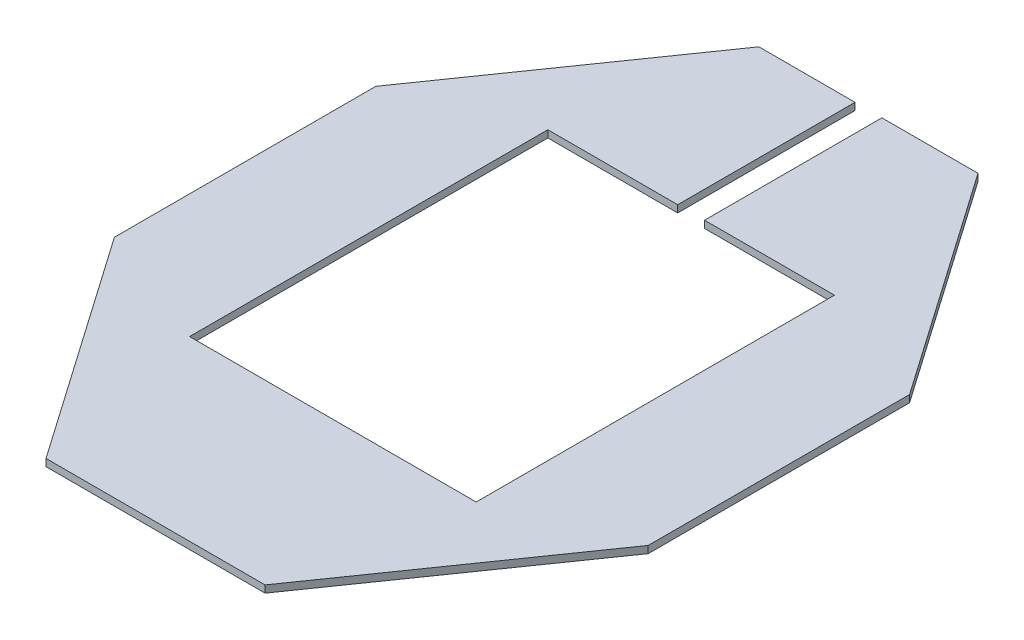
ISO-10303-21;
HEADER;
FILE_DESCRIPTION(('STEP AP214'),'2;1');
FILE_NAME('part.step','',(''),(''),'','','');
FILE_SCHEMA(('AUTOMOTIVE_DESIGN { 1 0 10303 214 1 1 1 1 }'));
ENDSEC;
DATA;
#1=APPLICATION_CONTEXT('core data for automotive mechanical design processes');
#2=APPLICATION_PROTOCOL_DEFINITION('international standard','automotive_design',2000,#1);
#3=PRODUCT_CONTEXT('',#1,'mechanical');
#4=PRODUCT('Part','Part','',(#3));
#5=PRODUCT_RELATED_PRODUCT_CATEGORY('part','',(#4));
#6=PRODUCT_DEFINITION_FORMATION('','',#4);
#7=PRODUCT_DEFINITION_CONTEXT('part definition',#1,'design');
#8=PRODUCT_DEFINITION('design','',#6,#7);
#9=PRODUCT_DEFINITION_SHAPE('','',#8);
#10=(LENGTH_UNIT() NAMED_UNIT(*) SI_UNIT(.MILLI.,.METRE.));
#11=(NAMED_UNIT(*) PLANE_ANGLE_UNIT() SI_UNIT($,.RADIAN.));
#12=(NAMED_UNIT(*) SI_UNIT($,.STERADIAN.) SOLID_ANGLE_UNIT());
#13=UNCERTAINTY_MEASURE_WITH_UNIT(LENGTH_MEASURE(1.E-05),#10,'distance_accuracy_value','');
#14=(GEOMETRIC_REPRESENTATION_CONTEXT(3) GLOBAL_UNCERTAINTY_ASSIGNED_CONTEXT((#13)) GLOBAL_UNIT_ASSIGNED_CONTEXT((#10,
#11,#12)) REPRESENTATION_CONTEXT('',''));
#15=CARTESIAN_POINT('',(0.,0.,0.));
#16=DIRECTION('',(0.,0.,1.));
#17=DIRECTION('',(1.,0.,0.));
#18=AXIS2_PLACEMENT_3D('',#15,#16,#17);
#19=CARTESIAN_POINT('',(-8.,4.375,-10.));
#20=DIRECTION('',(0.,0.,-1.));
#21=DIRECTION('',(-1.,0.,0.));
#22=AXIS2_PLACEMENT_3D('',#19,#20,#21);
#23=PLANE('',#22);
#24=DIRECTION('',(1.,0.,0.));
#25=VECTOR('',#24,1.);
#26=CARTESIAN_POINT('',(-8.,0.25,-10.));
#27=LINE('',#26,#25);
#28=CARTESIAN_POINT('',(-8.,0.25,-10.));
#29=VERTEX_POINT('',#28);
#30=CARTESIAN_POINT('',(-0.749999999999999,0.25,-10.));
#31=VERTEX_POINT('',#30);
#32=EDGE_CURVE('E184',#29,#31,#27,.T.);
#33=ORIENTED_EDGE('',*,*,#32,.T.);
#34=DIRECTION('',(0.,1.,0.));
#35=VECTOR('',#34,1.);
#36=CARTESIAN_POINT('',(-0.749999999999999,4.375,-10.));
#37=LINE('',#36,#35);
#38=CARTESIAN_POINT('',(-0.749999999999999,0.65,-10.));
#39=VERTEX_POINT('',#38);
#40=EDGE_CURVE('E217',#31,#39,#37,.T.);
#41=ORIENTED_EDGE('',*,*,#40,.T.);
#42=DIRECTION('',(-1.,0.,0.));
#43=VECTOR('',#42,1.);
#44=CARTESIAN_POINT('',(0.,0.65,-10.));
#45=LINE('',#44,#43);
#46=CARTESIAN_POINT('',(-8.,0.65,-10.));
#47=VERTEX_POINT('',#46);
#48=EDGE_CURVE('E196',#39,#47,#45,.T.);
#49=ORIENTED_EDGE('',*,*,#48,.T.);
#50=DIRECTION('',(0.,-1.,0.));
#51=VECTOR('',#50,1.);
#52=CARTESIAN_POINT('',(-8.,4.375,-10.));
#53=LINE('',#52,#51);
#54=EDGE_CURVE('E193',#47,#29,#53,.T.);
#55=ORIENTED_EDGE('',*,*,#54,.T.);
#56=EDGE_LOOP('',(#33,#41,#49,#55));
#57=FACE_BOUND('',#56,.T.);
#58=ADVANCED_FACE('F35',(#57),#23,.F.);
#59=CARTESIAN_POINT('',(0.,0.65,0.));
#60=DIRECTION('',(0.,1.,0.));
#61=DIRECTION('',(0.,0.,1.));
#62=AXIS2_PLACEMENT_3D('',#59,#60,#61);
#63=PLANE('',#62);
#64=DIRECTION('',(0.,0.,-1.));
#65=VECTOR('',#64,1.);
#66=CARTESIAN_POINT('',(-14.9,0.65,0.));
#67=LINE('',#66,#65);
#68=CARTESIAN_POINT('',(-14.9,0.65,7.29565217391304));
#69=VERTEX_POINT('',#68);
#70=CARTESIAN_POINT('',(-14.9,0.65,-7.29565217391304));
#71=VERTEX_POINT('',#70);
#72=EDGE_CURVE('E50',#69,#71,#67,.T.);
#73=ORIENTED_EDGE('',*,*,#72,.F.);
#74=DIRECTION('',(-0.571792661688173,0.,-0.820398166769987));
#75=VECTOR('',#74,1.);
#76=CARTESIAN_POINT('',(-13.4508652657602,0.65,9.37484548825711));
#77=LINE('',#76,#75);
#78=CARTESIAN_POINT('',(-6.11515151515152,0.65,19.9));
#79=VERTEX_POINT('',#78);
#80=EDGE_CURVE('E178',#79,#69,#77,.T.);
#81=ORIENTED_EDGE('',*,*,#80,.F.);
#82=DIRECTION('',(-1.,0.,0.));
#83=VECTOR('',#82,1.);
#84=CARTESIAN_POINT('',(0.,0.65,19.9));
#85=LINE('',#84,#83);
#86=CARTESIAN_POINT('',(6.11515151515152,0.65,19.9));
#87=VERTEX_POINT('',#86);
#88=EDGE_CURVE('E266',#87,#79,#85,.T.);
#89=ORIENTED_EDGE('',*,*,#88,.F.);
#90=DIRECTION('',(-0.571792661688173,0.,0.820398166769987));
#91=VECTOR('',#90,1.);
#92=CARTESIAN_POINT('',(13.4508652657602,0.65,9.37484548825711));
#93=LINE('',#92,#91);
#94=CARTESIAN_POINT('',(14.9,0.65,7.29565217391304));
#95=VERTEX_POINT('',#94);
#96=EDGE_CURVE('E174',#95,#87,#93,.T.);
#97=ORIENTED_EDGE('',*,*,#96,.F.);
#98=DIRECTION('',(0.,0.,1.));
#99=VECTOR('',#98,1.);
#100=CARTESIAN_POINT('',(14.9,0.65,0.));
#101=LINE('',#100,#99);
#102=CARTESIAN_POINT('',(14.9,0.65,-7.29565217391304));
#103=VERTEX_POINT('',#102);
#104=EDGE_CURVE('E261',#103,#95,#101,.T.);
#105=ORIENTED_EDGE('',*,*,#104,.F.);
#106=DIRECTION('',(0.571792661688173,0.,0.820398166769987));
#107=VECTOR('',#106,1.);
#108=CARTESIAN_POINT('',(13.4508652657602,0.65,-9.37484548825711));
#109=LINE('',#108,#107);
#110=CARTESIAN_POINT('',(6.11515151515152,0.65,-19.9));
#111=VERTEX_POINT('',#110);
#112=EDGE_CURVE('E165',#111,#103,#109,.T.);
#113=ORIENTED_EDGE('',*,*,#112,.F.);
#114=DIRECTION('',(1.,0.,0.));
#115=VECTOR('',#114,1.);
#116=CARTESIAN_POINT('',(0.,0.65,-19.9));
#117=LINE('',#116,#115);
#118=CARTESIAN_POINT('',(0.750000000000002,0.65,-19.9));
#119=VERTEX_POINT('',#118);
#120=EDGE_CURVE('E287',#119,#111,#117,.T.);
#121=ORIENTED_EDGE('',*,*,#120,.F.);
#122=DIRECTION('',(0.,0.,-1.));
#123=VECTOR('',#122,1.);
#124=CARTESIAN_POINT('',(0.75,0.65,0.));
#125=LINE('',#124,#123);
#126=CARTESIAN_POINT('',(0.750000000000001,0.65,-10.));
#127=VERTEX_POINT('',#126);
#128=EDGE_CURVE('E232',#127,#119,#125,.T.);
#129=ORIENTED_EDGE('',*,*,#128,.F.);
#130=CARTESIAN_POINT('',(8.,0.65,-10.));
#131=VERTEX_POINT('',#130);
#132=EDGE_CURVE('E204',#131,#127,#45,.T.);
#133=ORIENTED_EDGE('',*,*,#132,.F.);
#134=DIRECTION('',(0.,0.,-1.));
#135=VECTOR('',#134,1.);
#136=CARTESIAN_POINT('',(8.,0.65,0.));
#137=LINE('',#136,#135);
#138=CARTESIAN_POINT('',(8.,0.65,10.));
#139=VERTEX_POINT('',#138);
#140=EDGE_CURVE('E207',#139,#131,#137,.T.);
#141=ORIENTED_EDGE('',*,*,#140,.F.);
#142=DIRECTION('',(1.,0.,0.));
#143=VECTOR('',#142,1.);
#144=CARTESIAN_POINT('',(0.,0.65,10.));
#145=LINE('',#144,#143);
#146=CARTESIAN_POINT('',(-8.,0.65,10.));
#147=VERTEX_POINT('',#146);
#148=EDGE_CURVE('E210',#147,#139,#145,.T.);
#149=ORIENTED_EDGE('',*,*,#148,.F.);
#150=DIRECTION('',(0.,0.,1.));
#151=VECTOR('',#150,1.);
#152=CARTESIAN_POINT('',(-8.,0.65,0.));
#153=LINE('',#152,#151);
#154=EDGE_CURVE('E212',#47,#147,#153,.T.);
#155=ORIENTED_EDGE('',*,*,#154,.F.);
#156=ORIENTED_EDGE('',*,*,#48,.F.);
#157=DIRECTION('',(0.,0.,1.));
#158=VECTOR('',#157,1.);
#159=CARTESIAN_POINT('',(-0.75,0.65,0.));
#160=LINE('',#159,#158);
#161=CARTESIAN_POINT('',(-0.749999999999998,0.65,-19.9));
#162=VERTEX_POINT('',#161);
#163=EDGE_CURVE('E243',#162,#39,#160,.T.);
#164=ORIENTED_EDGE('',*,*,#163,.F.);
#165=CARTESIAN_POINT('',(-6.11515151515151,0.65,-19.9));
#166=VERTEX_POINT('',#165);
#167=EDGE_CURVE('E57',#166,#162,#117,.T.);
#168=ORIENTED_EDGE('',*,*,#167,.F.);
#169=DIRECTION('',(0.571792661688173,0.,-0.820398166769987));
#170=VECTOR('',#169,1.);
#171=CARTESIAN_POINT('',(-13.4508652657602,0.65,-9.37484548825711));
#172=LINE('',#171,#170);
#173=EDGE_CURVE('E164',#71,#166,#172,.T.);
#174=ORIENTED_EDGE('',*,*,#173,.F.);
#175=EDGE_LOOP('',(#73,#81,#89,#97,#105,#113,#121,#129,#133,#141,#149,#155,#156,#164,#168,#174));
#176=FACE_BOUND('',#175,.T.);
#177=ADVANCED_FACE('F37',(#176),#63,.T.);
#178=CARTESIAN_POINT('',(0.,0.25,0.));
#179=DIRECTION('',(0.,1.,0.));
#180=DIRECTION('',(0.,0.,1.));
#181=AXIS2_PLACEMENT_3D('',#178,#179,#180);
#182=PLANE('',#181);
#183=DIRECTION('',(0.571792661688173,0.,0.820398166769987));
#184=VECTOR('',#183,1.);
#185=CARTESIAN_POINT('',(-5.,0.25,21.5));
#186=LINE('',#185,#184);
#187=CARTESIAN_POINT('',(-14.9,0.25,7.29565217391305));
#188=VERTEX_POINT('',#187);
#189=CARTESIAN_POINT('',(-6.11515151515152,0.25,19.9));
#190=VERTEX_POINT('',#189);
#191=EDGE_CURVE('E159',#188,#190,#186,.T.);
#192=ORIENTED_EDGE('',*,*,#191,.F.);
#193=DIRECTION('',(0.,0.,-1.));
#194=VECTOR('',#193,1.);
#195=CARTESIAN_POINT('',(-14.9,0.25,0.));
#196=LINE('',#195,#194);
#197=CARTESIAN_POINT('',(-14.9,0.249999999999999,-7.29565217391304));
#198=VERTEX_POINT('',#197);
#199=EDGE_CURVE('E147',#188,#198,#196,.T.);
#200=ORIENTED_EDGE('',*,*,#199,.T.);
#201=DIRECTION('',(-0.571792661688173,0.,0.820398166769987));
#202=VECTOR('',#201,1.);
#203=CARTESIAN_POINT('',(-16.5,0.25,-5.));
#204=LINE('',#203,#202);
#205=CARTESIAN_POINT('',(-6.11515151515152,0.25,-19.9));
#206=VERTEX_POINT('',#205);
#207=EDGE_CURVE('E157',#206,#198,#204,.T.);
#208=ORIENTED_EDGE('',*,*,#207,.F.);
#209=DIRECTION('',(1.,0.,0.));
#210=VECTOR('',#209,1.);
#211=CARTESIAN_POINT('',(0.,0.25,-19.9));
#212=LINE('',#211,#210);
#213=CARTESIAN_POINT('',(-0.749999999999998,0.25,-19.9));
#214=VERTEX_POINT('',#213);
#215=EDGE_CURVE('E285',#206,#214,#212,.T.);
#216=ORIENTED_EDGE('',*,*,#215,.T.);
#217=DIRECTION('',(0.,0.,-1.));
#218=VECTOR('',#217,1.);
#219=CARTESIAN_POINT('',(-0.749999999999999,0.25,-10.));
#220=LINE('',#219,#218);
#221=EDGE_CURVE('E241',#31,#214,#220,.T.);
#222=ORIENTED_EDGE('',*,*,#221,.F.);
#223=ORIENTED_EDGE('',*,*,#32,.F.);
#224=DIRECTION('',(0.,0.,-1.));
#225=VECTOR('',#224,1.);
#226=CARTESIAN_POINT('',(-8.,0.25,-10.));
#227=LINE('',#226,#225);
#228=CARTESIAN_POINT('',(-8.,0.25,10.));
#229=VERTEX_POINT('',#228);
#230=EDGE_CURVE('E181',#229,#29,#227,.T.);
#231=ORIENTED_EDGE('',*,*,#230,.F.);
#232=DIRECTION('',(-1.,0.,0.));
#233=VECTOR('',#232,1.);
#234=CARTESIAN_POINT('',(-8.,0.25,10.));
#235=LINE('',#234,#233);
#236=CARTESIAN_POINT('',(8.,0.25,10.));
#237=VERTEX_POINT('',#236);
#238=EDGE_CURVE('E190',#237,#229,#235,.T.);
#239=ORIENTED_EDGE('',*,*,#238,.F.);
#240=DIRECTION('',(0.,0.,1.));
#241=VECTOR('',#240,1.);
#242=CARTESIAN_POINT('',(8.,0.25,-10.));
#243=LINE('',#242,#241);
#244=CARTESIAN_POINT('',(8.,0.25,-10.));
#245=VERTEX_POINT('',#244);
#246=EDGE_CURVE('E187',#245,#237,#243,.T.);
#247=ORIENTED_EDGE('',*,*,#246,.F.);
#248=CARTESIAN_POINT('',(0.750000000000002,0.25,-10.));
#249=VERTEX_POINT('',#248);
#250=EDGE_CURVE('E183',#249,#245,#27,.T.);
#251=ORIENTED_EDGE('',*,*,#250,.F.);
#252=DIRECTION('',(0.,0.,1.));
#253=VECTOR('',#252,1.);
#254=CARTESIAN_POINT('',(0.750000000000001,0.25,-10.));
#255=LINE('',#254,#253);
#256=CARTESIAN_POINT('',(0.750000000000002,0.25,-19.9));
#257=VERTEX_POINT('',#256);
#258=EDGE_CURVE('E230',#257,#249,#255,.T.);
#259=ORIENTED_EDGE('',*,*,#258,.F.);
#260=CARTESIAN_POINT('',(6.11515151515151,0.25,-19.9));
#261=VERTEX_POINT('',#260);
#262=EDGE_CURVE('E238',#257,#261,#212,.T.);
#263=ORIENTED_EDGE('',*,*,#262,.T.);
#264=DIRECTION('',(-0.571792661688173,0.,-0.820398166769987));
#265=VECTOR('',#264,1.);
#266=CARTESIAN_POINT('',(16.5,0.25,-5.));
#267=LINE('',#266,#265);
#268=CARTESIAN_POINT('',(14.9,0.25,-7.29565217391304));
#269=VERTEX_POINT('',#268);
#270=EDGE_CURVE('E169',#269,#261,#267,.T.);
#271=ORIENTED_EDGE('',*,*,#270,.F.);
#272=DIRECTION('',(0.,0.,1.));
#273=VECTOR('',#272,1.);
#274=CARTESIAN_POINT('',(14.9,0.25,0.));
#275=LINE('',#274,#273);
#276=CARTESIAN_POINT('',(14.9,0.25,7.29565217391303));
#277=VERTEX_POINT('',#276);
#278=EDGE_CURVE('E258',#269,#277,#275,.T.);
#279=ORIENTED_EDGE('',*,*,#278,.T.);
#280=DIRECTION('',(0.571792661688173,0.,-0.820398166769987));
#281=VECTOR('',#280,1.);
#282=CARTESIAN_POINT('',(5.,0.25,21.5));
#283=LINE('',#282,#281);
#284=CARTESIAN_POINT('',(6.11515151515152,0.25,19.9));
#285=VERTEX_POINT('',#284);
#286=EDGE_CURVE('E167',#285,#277,#283,.T.);
#287=ORIENTED_EDGE('',*,*,#286,.F.);
#288=DIRECTION('',(-1.,0.,0.));
#289=VECTOR('',#288,1.);
#290=CARTESIAN_POINT('',(0.,0.25,19.9));
#291=LINE('',#290,#289);
#292=EDGE_CURVE('E279',#285,#190,#291,.T.);
#293=ORIENTED_EDGE('',*,*,#292,.T.);
#294=EDGE_LOOP('',(#192,#200,#208,#216,#222,#223,#231,#239,#247,#251,#259,#263,#271,#279,#287,#293));
#295=FACE_BOUND('',#294,.T.);
#296=ADVANCED_FACE('F155',(#295),#182,.F.);
#297=CARTESIAN_POINT('',(-8.,4.375,-10.));
#298=DIRECTION('',(-1.,0.,0.));
#299=DIRECTION('',(0.,0.,1.));
#300=AXIS2_PLACEMENT_3D('',#297,#298,#299);
#301=PLANE('',#300);
#302=ORIENTED_EDGE('',*,*,#154,.T.);
#303=DIRECTION('',(0.,-1.,0.));
#304=VECTOR('',#303,1.);
#305=CARTESIAN_POINT('',(-8.,4.375,10.));
#306=LINE('',#305,#304);
#307=EDGE_CURVE('E194',#147,#229,#306,.T.);
#308=ORIENTED_EDGE('',*,*,#307,.T.);
#309=ORIENTED_EDGE('',*,*,#230,.T.);
#310=ORIENTED_EDGE('',*,*,#54,.F.);
#311=EDGE_LOOP('',(#302,#308,#309,#310));
#312=FACE_BOUND('',#311,.T.);
#313=ADVANCED_FACE('F308',(#312),#301,.F.);
#314=CARTESIAN_POINT('',(-8.,4.375,10.));
#315=DIRECTION('',(0.,0.,1.));
#316=DIRECTION('',(1.,0.,0.));
#317=AXIS2_PLACEMENT_3D('',#314,#315,#316);
#318=PLANE('',#317);
#319=ORIENTED_EDGE('',*,*,#148,.T.);
#320=DIRECTION('',(0.,-1.,0.));
#321=VECTOR('',#320,1.);
#322=CARTESIAN_POINT('',(8.,4.375,10.));
#323=LINE('',#322,#321);
#324=EDGE_CURVE('E197',#139,#237,#323,.T.);
#325=ORIENTED_EDGE('',*,*,#324,.T.);
#326=ORIENTED_EDGE('',*,*,#238,.T.);
#327=ORIENTED_EDGE('',*,*,#307,.F.);
#328=EDGE_LOOP('',(#319,#325,#326,#327));
#329=FACE_BOUND('',#328,.T.);
#330=ADVANCED_FACE('F310',(#329),#318,.F.);
#331=CARTESIAN_POINT('',(8.,4.375,-10.));
#332=DIRECTION('',(1.,0.,0.));
#333=DIRECTION('',(0.,0.,-1.));
#334=AXIS2_PLACEMENT_3D('',#331,#332,#333);
#335=PLANE('',#334);
#336=ORIENTED_EDGE('',*,*,#140,.T.);
#337=DIRECTION('',(0.,-1.,0.));
#338=VECTOR('',#337,1.);
#339=CARTESIAN_POINT('',(8.,4.375,-10.));
#340=LINE('',#339,#338);
#341=EDGE_CURVE('E199',#131,#245,#340,.T.);
#342=ORIENTED_EDGE('',*,*,#341,.T.);
#343=ORIENTED_EDGE('',*,*,#246,.T.);
#344=ORIENTED_EDGE('',*,*,#324,.F.);
#345=EDGE_LOOP('',(#336,#342,#343,#344));
#346=FACE_BOUND('',#345,.T.);
#347=ADVANCED_FACE('F315',(#346),#335,.F.);
#348=ORIENTED_EDGE('',*,*,#132,.T.);
#349=DIRECTION('',(0.,-1.,0.));
#350=VECTOR('',#349,1.);
#351=CARTESIAN_POINT('',(0.750000000000001,4.375,-10.));
#352=LINE('',#351,#350);
#353=EDGE_CURVE('E214',#127,#249,#352,.T.);
#354=ORIENTED_EDGE('',*,*,#353,.T.);
#355=ORIENTED_EDGE('',*,*,#250,.T.);
#356=ORIENTED_EDGE('',*,*,#341,.F.);
#357=EDGE_LOOP('',(#348,#354,#355,#356));
#358=FACE_BOUND('',#357,.T.);
#359=ADVANCED_FACE('F318',(#358),#23,.F.);
#360=CARTESIAN_POINT('',(-5.,4.375,21.5));
#361=DIRECTION('',(0.820398166769987,0.,-0.571792661688173));
#362=DIRECTION('',(-0.571792661688173,0.,-0.820398166769987));
#363=AXIS2_PLACEMENT_3D('',#360,#361,#362);
#364=PLANE('',#363);
#365=ORIENTED_EDGE('',*,*,#80,.T.);
#366=DIRECTION('',(0.,-1.,0.));
#367=VECTOR('',#366,1.);
#368=CARTESIAN_POINT('',(-14.9,4.375,7.29565217391304));
#369=LINE('',#368,#367);
#370=EDGE_CURVE('E290',#69,#188,#369,.T.);
#371=ORIENTED_EDGE('',*,*,#370,.T.);
#372=ORIENTED_EDGE('',*,*,#191,.T.);
#373=DIRECTION('',(0.,1.,0.));
#374=VECTOR('',#373,1.);
#375=CARTESIAN_POINT('',(-6.11515151515152,4.375,19.9));
#376=LINE('',#375,#374);
#377=EDGE_CURVE('E262',#190,#79,#376,.T.);
#378=ORIENTED_EDGE('',*,*,#377,.T.);
#379=EDGE_LOOP('',(#365,#371,#372,#378));
#380=FACE_BOUND('',#379,.T.);
#381=ADVANCED_FACE('F293',(#380),#364,.F.);
#382=CARTESIAN_POINT('',(5.,4.375,21.5));
#383=DIRECTION('',(-0.820398166769987,0.,-0.571792661688173));
#384=DIRECTION('',(-0.571792661688173,0.,0.820398166769987));
#385=AXIS2_PLACEMENT_3D('',#382,#383,#384);
#386=PLANE('',#385);
#387=ORIENTED_EDGE('',*,*,#96,.T.);
#388=DIRECTION('',(0.,-1.,0.));
#389=VECTOR('',#388,1.);
#390=CARTESIAN_POINT('',(6.11515151515152,4.375,19.9));
#391=LINE('',#390,#389);
#392=EDGE_CURVE('E223',#87,#285,#391,.T.);
#393=ORIENTED_EDGE('',*,*,#392,.T.);
#394=ORIENTED_EDGE('',*,*,#286,.T.);
#395=DIRECTION('',(0.,1.,0.));
#396=VECTOR('',#395,1.);
#397=CARTESIAN_POINT('',(14.9,4.375,7.29565217391304));
#398=LINE('',#397,#396);
#399=EDGE_CURVE('E246',#277,#95,#398,.T.);
#400=ORIENTED_EDGE('',*,*,#399,.T.);
#401=EDGE_LOOP('',(#387,#393,#394,#400));
#402=FACE_BOUND('',#401,.T.);
#403=ADVANCED_FACE('F272',(#402),#386,.F.);
#404=CARTESIAN_POINT('',(-16.5,4.375,-5.));
#405=DIRECTION('',(0.820398166769987,0.,0.571792661688173));
#406=DIRECTION('',(0.571792661688173,0.,-0.820398166769987));
#407=AXIS2_PLACEMENT_3D('',#404,#405,#406);
#408=PLANE('',#407);
#409=ORIENTED_EDGE('',*,*,#207,.T.);
#410=DIRECTION('',(0.,1.,0.));
#411=VECTOR('',#410,1.);
#412=CARTESIAN_POINT('',(-14.9,4.375,-7.29565217391304));
#413=LINE('',#412,#411);
#414=EDGE_CURVE('E11',#198,#71,#413,.T.);
#415=ORIENTED_EDGE('',*,*,#414,.T.);
#416=ORIENTED_EDGE('',*,*,#173,.T.);
#417=DIRECTION('',(0.,-1.,0.));
#418=VECTOR('',#417,1.);
#419=CARTESIAN_POINT('',(-6.11515151515152,4.375,-19.9));
#420=LINE('',#419,#418);
#421=EDGE_CURVE('E163',#166,#206,#420,.T.);
#422=ORIENTED_EDGE('',*,*,#421,.T.);
#423=EDGE_LOOP('',(#409,#415,#416,#422));
#424=FACE_BOUND('',#423,.T.);
#425=ADVANCED_FACE('F162',(#424),#408,.F.);
#426=CARTESIAN_POINT('',(16.5,4.375,-5.));
#427=DIRECTION('',(-0.820398166769987,0.,0.571792661688173));
#428=DIRECTION('',(0.571792661688173,0.,0.820398166769987));
#429=AXIS2_PLACEMENT_3D('',#426,#427,#428);
#430=PLANE('',#429);
#431=ORIENTED_EDGE('',*,*,#270,.T.);
#432=DIRECTION('',(0.,1.,0.));
#433=VECTOR('',#432,1.);
#434=CARTESIAN_POINT('',(6.11515151515152,4.375,-19.9));
#435=LINE('',#434,#433);
#436=EDGE_CURVE('E253',#261,#111,#435,.T.);
#437=ORIENTED_EDGE('',*,*,#436,.T.);
#438=ORIENTED_EDGE('',*,*,#112,.T.);
#439=DIRECTION('',(0.,-1.,0.));
#440=VECTOR('',#439,1.);
#441=CARTESIAN_POINT('',(14.9,4.375,-7.29565217391304));
#442=LINE('',#441,#440);
#443=EDGE_CURVE('E220',#103,#269,#442,.T.);
#444=ORIENTED_EDGE('',*,*,#443,.T.);
#445=EDGE_LOOP('',(#431,#437,#438,#444));
#446=FACE_BOUND('',#445,.T.);
#447=ADVANCED_FACE('F252',(#446),#430,.F.);
#448=CARTESIAN_POINT('',(-0.749999999999999,10.25,-10.));
#449=DIRECTION('',(-1.,0.,0.));
#450=DIRECTION('',(0.,0.,1.));
#451=AXIS2_PLACEMENT_3D('',#448,#449,#450);
#452=PLANE('',#451);
#453=ORIENTED_EDGE('',*,*,#221,.T.);
#454=DIRECTION('',(0.,1.,0.));
#455=VECTOR('',#454,1.);
#456=CARTESIAN_POINT('',(-0.749999999999998,10.25,-19.9));
#457=LINE('',#456,#455);
#458=EDGE_CURVE('E283',#214,#162,#457,.T.);
#459=ORIENTED_EDGE('',*,*,#458,.T.);
#460=ORIENTED_EDGE('',*,*,#163,.T.);
#461=ORIENTED_EDGE('',*,*,#40,.F.);
#462=EDGE_LOOP('',(#453,#459,#460,#461));
#463=FACE_BOUND('',#462,.T.);
#464=ADVANCED_FACE('F299',(#463),#452,.F.);
#465=CARTESIAN_POINT('',(0.750000000000001,10.25,-10.));
#466=DIRECTION('',(1.,0.,0.));
#467=DIRECTION('',(0.,0.,-1.));
#468=AXIS2_PLACEMENT_3D('',#465,#466,#467);
#469=PLANE('',#468);
#470=ORIENTED_EDGE('',*,*,#128,.T.);
#471=DIRECTION('',(0.,-1.,0.));
#472=VECTOR('',#471,1.);
#473=CARTESIAN_POINT('',(0.750000000000002,10.25,-19.9));
#474=LINE('',#473,#472);
#475=EDGE_CURVE('E43',#119,#257,#474,.T.);
#476=ORIENTED_EDGE('',*,*,#475,.T.);
#477=ORIENTED_EDGE('',*,*,#258,.T.);
#478=ORIENTED_EDGE('',*,*,#353,.F.);
#479=EDGE_LOOP('',(#470,#476,#477,#478));
#480=FACE_BOUND('',#479,.T.);
#481=ADVANCED_FACE('F229',(#480),#469,.F.);
#482=CARTESIAN_POINT('',(14.9,5.25,11.7880750810146));
#483=DIRECTION('',(-1.,0.,0.));
#484=DIRECTION('',(0.,0.,1.));
#485=AXIS2_PLACEMENT_3D('',#482,#483,#484);
#486=PLANE('',#485);
#487=ORIENTED_EDGE('',*,*,#278,.F.);
#488=ORIENTED_EDGE('',*,*,#443,.F.);
#489=ORIENTED_EDGE('',*,*,#104,.T.);
#490=ORIENTED_EDGE('',*,*,#399,.F.);
#491=EDGE_LOOP('',(#487,#488,#489,#490));
#492=FACE_BOUND('',#491,.T.);
#493=ADVANCED_FACE('F327',(#492),#486,.F.);
#494=CARTESIAN_POINT('',(10.5231406774872,5.25,19.9));
#495=DIRECTION('',(0.,0.,-1.));
#496=DIRECTION('',(-1.,0.,0.));
#497=AXIS2_PLACEMENT_3D('',#494,#495,#496);
#498=PLANE('',#497);
#499=ORIENTED_EDGE('',*,*,#292,.F.);
#500=ORIENTED_EDGE('',*,*,#392,.F.);
#501=ORIENTED_EDGE('',*,*,#88,.T.);
#502=ORIENTED_EDGE('',*,*,#377,.F.);
#503=EDGE_LOOP('',(#499,#500,#501,#502));
#504=FACE_BOUND('',#503,.T.);
#505=ADVANCED_FACE('F321',(#504),#498,.F.);
#506=CARTESIAN_POINT('',(-10.2725897089756,5.25,-19.9));
#507=DIRECTION('',(0.,0.,1.));
#508=DIRECTION('',(1.,0.,0.));
#509=AXIS2_PLACEMENT_3D('',#506,#507,#508);
#510=PLANE('',#509);
#511=ORIENTED_EDGE('',*,*,#262,.F.);
#512=ORIENTED_EDGE('',*,*,#475,.F.);
#513=ORIENTED_EDGE('',*,*,#120,.T.);
#514=ORIENTED_EDGE('',*,*,#436,.F.);
#515=EDGE_LOOP('',(#511,#512,#513,#514));
#516=FACE_BOUND('',#515,.T.);
#517=ADVANCED_FACE('F319',(#516),#510,.F.);
#518=ORIENTED_EDGE('',*,*,#167,.T.);
#519=ORIENTED_EDGE('',*,*,#458,.F.);
#520=ORIENTED_EDGE('',*,*,#215,.F.);
#521=ORIENTED_EDGE('',*,*,#421,.F.);
#522=EDGE_LOOP('',(#518,#519,#520,#521));
#523=FACE_BOUND('',#522,.T.);
#524=ADVANCED_FACE('F295',(#523),#510,.F.);
#525=CARTESIAN_POINT('',(-14.9,5.25,-11.1790970325488));
#526=DIRECTION('',(1.,0.,0.));
#527=DIRECTION('',(0.,0.,-1.));
#528=AXIS2_PLACEMENT_3D('',#525,#526,#527);
#529=PLANE('',#528);
#530=ORIENTED_EDGE('',*,*,#72,.T.);
#531=ORIENTED_EDGE('',*,*,#414,.F.);
#532=ORIENTED_EDGE('',*,*,#199,.F.);
#533=ORIENTED_EDGE('',*,*,#370,.F.);
#534=EDGE_LOOP('',(#530,#531,#532,#533));
#535=FACE_BOUND('',#534,.T.);
#536=ADVANCED_FACE('F146',(#535),#529,.F.);
#537=CLOSED_SHELL('',(#58,#177,#296,#313,#330,#347,#359,#381,#403,#425,#447,#464,#481,#493,#505,
#517,#524,#536));
#538=MANIFOLD_SOLID_BREP('B2',#537);
#539=ADVANCED_BREP_SHAPE_REPRESENTATION('',(#18,#538),#14);
#540=SHAPE_DEFINITION_REPRESENTATION(#9,#539);
ENDSEC;
END-ISO-10303-21;
